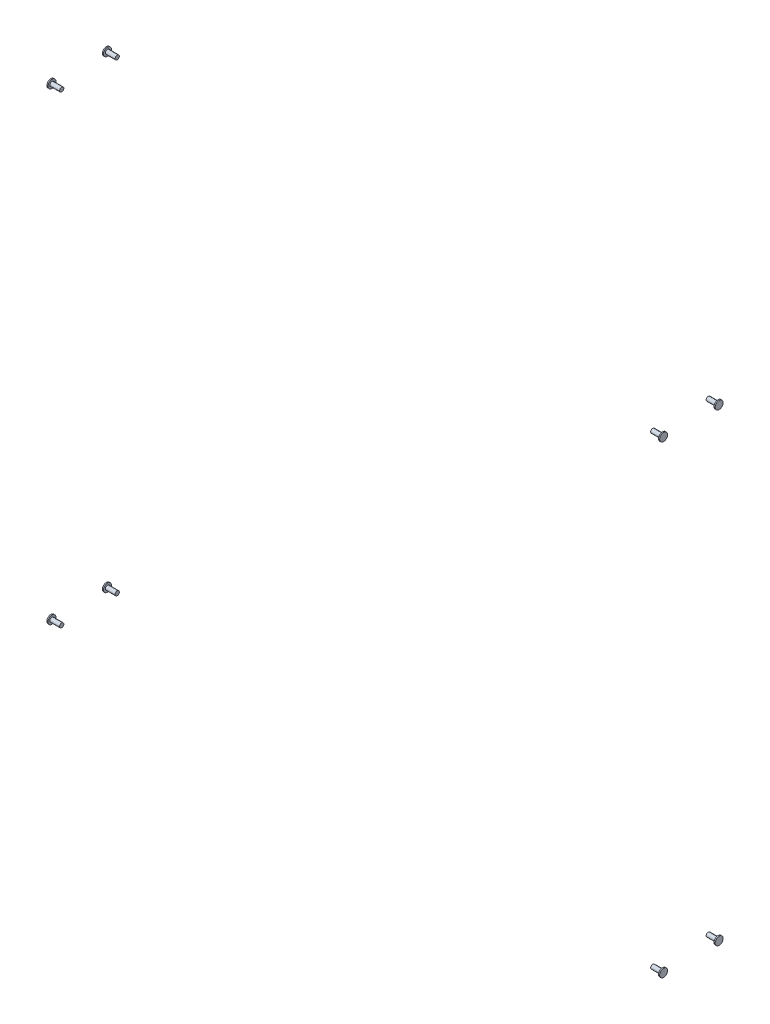
ISO-10303-21;
HEADER;
FILE_DESCRIPTION(('STEP AP214'),'2;1');
FILE_NAME('part.step','',(''),(''),'','','');
FILE_SCHEMA(('AUTOMOTIVE_DESIGN { 1 0 10303 214 1 1 1 1 }'));
ENDSEC;
DATA;
#1=APPLICATION_CONTEXT('core data for automotive mechanical design processes');
#2=APPLICATION_PROTOCOL_DEFINITION('international standard','automotive_design',2000,#1);
#3=PRODUCT_CONTEXT('',#1,'mechanical');
#4=PRODUCT('Part','Part','',(#3));
#5=PRODUCT_RELATED_PRODUCT_CATEGORY('part','',(#4));
#6=PRODUCT_DEFINITION_FORMATION('','',#4);
#7=PRODUCT_DEFINITION_CONTEXT('part definition',#1,'design');
#8=PRODUCT_DEFINITION('design','',#6,#7);
#9=PRODUCT_DEFINITION_SHAPE('','',#8);
#10=(LENGTH_UNIT() NAMED_UNIT(*) SI_UNIT(.MILLI.,.METRE.));
#11=(NAMED_UNIT(*) PLANE_ANGLE_UNIT() SI_UNIT($,.RADIAN.));
#12=(NAMED_UNIT(*) SI_UNIT($,.STERADIAN.) SOLID_ANGLE_UNIT());
#13=UNCERTAINTY_MEASURE_WITH_UNIT(LENGTH_MEASURE(1.E-05),#10,'distance_accuracy_value','');
#14=(GEOMETRIC_REPRESENTATION_CONTEXT(3) GLOBAL_UNCERTAINTY_ASSIGNED_CONTEXT((#13)) GLOBAL_UNIT_ASSIGNED_CONTEXT((#10,
#11,#12)) REPRESENTATION_CONTEXT('',''));
#15=CARTESIAN_POINT('',(0.,0.,0.));
#16=DIRECTION('',(0.,0.,1.));
#17=DIRECTION('',(1.,0.,0.));
#18=AXIS2_PLACEMENT_3D('',#15,#16,#17);
#19=CARTESIAN_POINT('',(-266.2,-209.,30.));
#20=DIRECTION('',(1.,0.,0.));
#21=DIRECTION('',(0.,0.,-1.));
#22=AXIS2_PLACEMENT_3D('',#19,#20,#21);
#23=PLANE('',#22);
#24=CARTESIAN_POINT('',(-266.2,-209.,30.));
#25=DIRECTION('',(-1.,0.,0.));
#26=DIRECTION('',(0.,0.,1.));
#27=AXIS2_PLACEMENT_3D('',#24,#25,#26);
#28=CIRCLE('',#27,1.9);
#29=CARTESIAN_POINT('',(-266.2,-209.,31.9));
#30=VERTEX_POINT('',#29);
#31=EDGE_CURVE('P0_E23',#30,#30,#28,.T.);
#32=ORIENTED_EDGE('',*,*,#31,.F.);
#33=EDGE_LOOP('',(#32));
#34=FACE_BOUND('',#33,.T.);
#35=ADVANCED_FACE('P0_F15',(#34),#23,.T.);
#36=CARTESIAN_POINT('',(-266.2,-209.,30.));
#37=DIRECTION('',(-1.,0.,0.));
#38=DIRECTION('',(0.,0.,1.));
#39=AXIS2_PLACEMENT_3D('',#36,#37,#38);
#40=CYLINDRICAL_SURFACE('',#39,1.9);
#41=CARTESIAN_POINT('',(-275.,-209.,30.));
#42=DIRECTION('',(1.,0.,0.));
#43=DIRECTION('',(0.,0.,-1.));
#44=AXIS2_PLACEMENT_3D('',#41,#42,#43);
#45=CIRCLE('',#44,1.9);
#46=CARTESIAN_POINT('',(-275.,-209.,28.1));
#47=VERTEX_POINT('',#46);
#48=EDGE_CURVE('P0_E10',#47,#47,#45,.F.);
#49=ORIENTED_EDGE('',*,*,#48,.F.);
#50=EDGE_LOOP('',(#49));
#51=FACE_BOUND('',#50,.T.);
#52=ORIENTED_EDGE('',*,*,#31,.T.);
#53=EDGE_LOOP('',(#52));
#54=FACE_BOUND('',#53,.T.);
#55=ADVANCED_FACE('P0_F17',(#51,#54),#40,.T.);
#56=CARTESIAN_POINT('',(-275.,-209.,30.));
#57=DIRECTION('',(1.,0.,0.));
#58=DIRECTION('',(0.,0.,-1.));
#59=AXIS2_PLACEMENT_3D('',#56,#57,#58);
#60=PLANE('',#59);
#61=ORIENTED_EDGE('',*,*,#48,.T.);
#62=EDGE_LOOP('',(#61));
#63=FACE_BOUND('',#62,.T.);
#64=CARTESIAN_POINT('',(-275.,-209.,30.));
#65=DIRECTION('',(-1.,0.,0.));
#66=DIRECTION('',(0.,0.,1.));
#67=AXIS2_PLACEMENT_3D('',#64,#65,#66);
#68=CIRCLE('',#67,3.6);
#69=CARTESIAN_POINT('',(-275.,-209.,33.6));
#70=VERTEX_POINT('',#69);
#71=EDGE_CURVE('P0_E35',#70,#70,#68,.T.);
#72=ORIENTED_EDGE('',*,*,#71,.F.);
#73=EDGE_LOOP('',(#72));
#74=FACE_BOUND('',#73,.T.);
#75=ADVANCED_FACE('P0_F43',(#63,#74),#60,.T.);
#76=CARTESIAN_POINT('',(-275.,-209.,30.));
#77=DIRECTION('',(-1.,0.,0.));
#78=DIRECTION('',(0.,0.,1.));
#79=AXIS2_PLACEMENT_3D('',#76,#77,#78);
#80=CYLINDRICAL_SURFACE('',#79,3.6);
#81=CARTESIAN_POINT('',(-276.,-209.,30.));
#82=DIRECTION('',(1.,0.,0.));
#83=DIRECTION('',(0.,0.,-1.));
#84=AXIS2_PLACEMENT_3D('',#81,#82,#83);
#85=CIRCLE('',#84,3.6);
#86=CARTESIAN_POINT('',(-276.,-209.,26.4));
#87=VERTEX_POINT('',#86);
#88=EDGE_CURVE('P0_E30',#87,#87,#85,.T.);
#89=ORIENTED_EDGE('',*,*,#88,.T.);
#90=EDGE_LOOP('',(#89));
#91=FACE_BOUND('',#90,.T.);
#92=ORIENTED_EDGE('',*,*,#71,.T.);
#93=EDGE_LOOP('',(#92));
#94=FACE_BOUND('',#93,.T.);
#95=ADVANCED_FACE('P0_F41',(#91,#94),#80,.T.);
#96=CARTESIAN_POINT('',(-276.,-209.,30.));
#97=DIRECTION('',(-1.,0.,0.));
#98=DIRECTION('',(0.,0.,1.));
#99=AXIS2_PLACEMENT_3D('',#96,#97,#98);
#100=PLANE('',#99);
#101=ORIENTED_EDGE('',*,*,#88,.F.);
#102=EDGE_LOOP('',(#101));
#103=FACE_BOUND('',#102,.T.);
#104=ADVANCED_FACE('P0_F50',(#103),#100,.T.);
#105=CLOSED_SHELL('',(#35,#55,#75,#95,#104));
#106=MANIFOLD_SOLID_BREP('P0_B1',#105);
#107=CARTESIAN_POINT('',(-266.2,-209.,80.));
#108=DIRECTION('',(1.,0.,0.));
#109=DIRECTION('',(0.,0.,-1.));
#110=AXIS2_PLACEMENT_3D('',#107,#108,#109);
#111=PLANE('',#110);
#112=CARTESIAN_POINT('',(-266.2,-209.,80.));
#113=DIRECTION('',(-1.,0.,0.));
#114=DIRECTION('',(0.,0.,1.));
#115=AXIS2_PLACEMENT_3D('',#112,#113,#114);
#116=CIRCLE('',#115,1.9);
#117=CARTESIAN_POINT('',(-266.2,-209.,81.9));
#118=VERTEX_POINT('',#117);
#119=EDGE_CURVE('P1_E23',#118,#118,#116,.T.);
#120=ORIENTED_EDGE('',*,*,#119,.F.);
#121=EDGE_LOOP('',(#120));
#122=FACE_BOUND('',#121,.T.);
#123=ADVANCED_FACE('P1_F15',(#122),#111,.T.);
#124=CARTESIAN_POINT('',(-266.2,-209.,80.));
#125=DIRECTION('',(-1.,0.,0.));
#126=DIRECTION('',(0.,0.,1.));
#127=AXIS2_PLACEMENT_3D('',#124,#125,#126);
#128=CYLINDRICAL_SURFACE('',#127,1.9);
#129=CARTESIAN_POINT('',(-275.,-209.,80.));
#130=DIRECTION('',(1.,0.,0.));
#131=DIRECTION('',(0.,0.,-1.));
#132=AXIS2_PLACEMENT_3D('',#129,#130,#131);
#133=CIRCLE('',#132,1.9);
#134=CARTESIAN_POINT('',(-275.,-209.,78.1));
#135=VERTEX_POINT('',#134);
#136=EDGE_CURVE('P1_E10',#135,#135,#133,.F.);
#137=ORIENTED_EDGE('',*,*,#136,.F.);
#138=EDGE_LOOP('',(#137));
#139=FACE_BOUND('',#138,.T.);
#140=ORIENTED_EDGE('',*,*,#119,.T.);
#141=EDGE_LOOP('',(#140));
#142=FACE_BOUND('',#141,.T.);
#143=ADVANCED_FACE('P1_F17',(#139,#142),#128,.T.);
#144=CARTESIAN_POINT('',(-275.,-209.,80.));
#145=DIRECTION('',(1.,0.,0.));
#146=DIRECTION('',(0.,0.,-1.));
#147=AXIS2_PLACEMENT_3D('',#144,#145,#146);
#148=PLANE('',#147);
#149=ORIENTED_EDGE('',*,*,#136,.T.);
#150=EDGE_LOOP('',(#149));
#151=FACE_BOUND('',#150,.T.);
#152=CARTESIAN_POINT('',(-275.,-209.,80.));
#153=DIRECTION('',(-1.,0.,0.));
#154=DIRECTION('',(0.,0.,1.));
#155=AXIS2_PLACEMENT_3D('',#152,#153,#154);
#156=CIRCLE('',#155,3.6);
#157=CARTESIAN_POINT('',(-275.,-209.,83.6));
#158=VERTEX_POINT('',#157);
#159=EDGE_CURVE('P1_E35',#158,#158,#156,.T.);
#160=ORIENTED_EDGE('',*,*,#159,.F.);
#161=EDGE_LOOP('',(#160));
#162=FACE_BOUND('',#161,.T.);
#163=ADVANCED_FACE('P1_F43',(#151,#162),#148,.T.);
#164=CARTESIAN_POINT('',(-275.,-209.,80.));
#165=DIRECTION('',(-1.,0.,0.));
#166=DIRECTION('',(0.,0.,1.));
#167=AXIS2_PLACEMENT_3D('',#164,#165,#166);
#168=CYLINDRICAL_SURFACE('',#167,3.6);
#169=CARTESIAN_POINT('',(-276.,-209.,80.));
#170=DIRECTION('',(1.,0.,0.));
#171=DIRECTION('',(0.,0.,-1.));
#172=AXIS2_PLACEMENT_3D('',#169,#170,#171);
#173=CIRCLE('',#172,3.6);
#174=CARTESIAN_POINT('',(-276.,-209.,76.4));
#175=VERTEX_POINT('',#174);
#176=EDGE_CURVE('P1_E30',#175,#175,#173,.T.);
#177=ORIENTED_EDGE('',*,*,#176,.T.);
#178=EDGE_LOOP('',(#177));
#179=FACE_BOUND('',#178,.T.);
#180=ORIENTED_EDGE('',*,*,#159,.T.);
#181=EDGE_LOOP('',(#180));
#182=FACE_BOUND('',#181,.T.);
#183=ADVANCED_FACE('P1_F41',(#179,#182),#168,.T.);
#184=CARTESIAN_POINT('',(-276.,-209.,80.));
#185=DIRECTION('',(-1.,0.,0.));
#186=DIRECTION('',(0.,0.,1.));
#187=AXIS2_PLACEMENT_3D('',#184,#185,#186);
#188=PLANE('',#187);
#189=ORIENTED_EDGE('',*,*,#176,.F.);
#190=EDGE_LOOP('',(#189));
#191=FACE_BOUND('',#190,.T.);
#192=ADVANCED_FACE('P1_F50',(#191),#188,.T.);
#193=CLOSED_SHELL('',(#123,#143,#163,#183,#192));
#194=MANIFOLD_SOLID_BREP('P1_B1',#193);
#195=CARTESIAN_POINT('',(-266.2,209.,30.));
#196=DIRECTION('',(1.,0.,0.));
#197=DIRECTION('',(0.,0.,-1.));
#198=AXIS2_PLACEMENT_3D('',#195,#196,#197);
#199=PLANE('',#198);
#200=CARTESIAN_POINT('',(-266.2,209.,30.));
#201=DIRECTION('',(-1.,0.,0.));
#202=DIRECTION('',(0.,0.,1.));
#203=AXIS2_PLACEMENT_3D('',#200,#201,#202);
#204=CIRCLE('',#203,1.9);
#205=CARTESIAN_POINT('',(-266.2,209.,31.9));
#206=VERTEX_POINT('',#205);
#207=EDGE_CURVE('P2_E23',#206,#206,#204,.T.);
#208=ORIENTED_EDGE('',*,*,#207,.F.);
#209=EDGE_LOOP('',(#208));
#210=FACE_BOUND('',#209,.T.);
#211=ADVANCED_FACE('P2_F15',(#210),#199,.T.);
#212=CARTESIAN_POINT('',(-266.2,209.,30.));
#213=DIRECTION('',(-1.,0.,0.));
#214=DIRECTION('',(0.,0.,1.));
#215=AXIS2_PLACEMENT_3D('',#212,#213,#214);
#216=CYLINDRICAL_SURFACE('',#215,1.9);
#217=CARTESIAN_POINT('',(-275.,209.,30.));
#218=DIRECTION('',(1.,0.,0.));
#219=DIRECTION('',(0.,0.,-1.));
#220=AXIS2_PLACEMENT_3D('',#217,#218,#219);
#221=CIRCLE('',#220,1.9);
#222=CARTESIAN_POINT('',(-275.,209.,28.1));
#223=VERTEX_POINT('',#222);
#224=EDGE_CURVE('P2_E10',#223,#223,#221,.F.);
#225=ORIENTED_EDGE('',*,*,#224,.F.);
#226=EDGE_LOOP('',(#225));
#227=FACE_BOUND('',#226,.T.);
#228=ORIENTED_EDGE('',*,*,#207,.T.);
#229=EDGE_LOOP('',(#228));
#230=FACE_BOUND('',#229,.T.);
#231=ADVANCED_FACE('P2_F17',(#227,#230),#216,.T.);
#232=CARTESIAN_POINT('',(-275.,209.,30.));
#233=DIRECTION('',(1.,0.,0.));
#234=DIRECTION('',(0.,0.,-1.));
#235=AXIS2_PLACEMENT_3D('',#232,#233,#234);
#236=PLANE('',#235);
#237=ORIENTED_EDGE('',*,*,#224,.T.);
#238=EDGE_LOOP('',(#237));
#239=FACE_BOUND('',#238,.T.);
#240=CARTESIAN_POINT('',(-275.,209.,30.));
#241=DIRECTION('',(-1.,0.,0.));
#242=DIRECTION('',(0.,0.,1.));
#243=AXIS2_PLACEMENT_3D('',#240,#241,#242);
#244=CIRCLE('',#243,3.6);
#245=CARTESIAN_POINT('',(-275.,209.,33.6));
#246=VERTEX_POINT('',#245);
#247=EDGE_CURVE('P2_E35',#246,#246,#244,.T.);
#248=ORIENTED_EDGE('',*,*,#247,.F.);
#249=EDGE_LOOP('',(#248));
#250=FACE_BOUND('',#249,.T.);
#251=ADVANCED_FACE('P2_F43',(#239,#250),#236,.T.);
#252=CARTESIAN_POINT('',(-275.,209.,30.));
#253=DIRECTION('',(-1.,0.,0.));
#254=DIRECTION('',(0.,0.,1.));
#255=AXIS2_PLACEMENT_3D('',#252,#253,#254);
#256=CYLINDRICAL_SURFACE('',#255,3.6);
#257=CARTESIAN_POINT('',(-276.,209.,30.));
#258=DIRECTION('',(1.,0.,0.));
#259=DIRECTION('',(0.,0.,-1.));
#260=AXIS2_PLACEMENT_3D('',#257,#258,#259);
#261=CIRCLE('',#260,3.6);
#262=CARTESIAN_POINT('',(-276.,209.,26.4));
#263=VERTEX_POINT('',#262);
#264=EDGE_CURVE('P2_E30',#263,#263,#261,.T.);
#265=ORIENTED_EDGE('',*,*,#264,.T.);
#266=EDGE_LOOP('',(#265));
#267=FACE_BOUND('',#266,.T.);
#268=ORIENTED_EDGE('',*,*,#247,.T.);
#269=EDGE_LOOP('',(#268));
#270=FACE_BOUND('',#269,.T.);
#271=ADVANCED_FACE('P2_F41',(#267,#270),#256,.T.);
#272=CARTESIAN_POINT('',(-276.,209.,30.));
#273=DIRECTION('',(-1.,0.,0.));
#274=DIRECTION('',(0.,0.,1.));
#275=AXIS2_PLACEMENT_3D('',#272,#273,#274);
#276=PLANE('',#275);
#277=ORIENTED_EDGE('',*,*,#264,.F.);
#278=EDGE_LOOP('',(#277));
#279=FACE_BOUND('',#278,.T.);
#280=ADVANCED_FACE('P2_F50',(#279),#276,.T.);
#281=CLOSED_SHELL('',(#211,#231,#251,#271,#280));
#282=MANIFOLD_SOLID_BREP('P2_B1',#281);
#283=CARTESIAN_POINT('',(-266.2,209.,80.));
#284=DIRECTION('',(1.,0.,0.));
#285=DIRECTION('',(0.,0.,-1.));
#286=AXIS2_PLACEMENT_3D('',#283,#284,#285);
#287=PLANE('',#286);
#288=CARTESIAN_POINT('',(-266.2,209.,80.));
#289=DIRECTION('',(-1.,0.,0.));
#290=DIRECTION('',(0.,0.,1.));
#291=AXIS2_PLACEMENT_3D('',#288,#289,#290);
#292=CIRCLE('',#291,1.9);
#293=CARTESIAN_POINT('',(-266.2,209.,81.9));
#294=VERTEX_POINT('',#293);
#295=EDGE_CURVE('P3_E23',#294,#294,#292,.T.);
#296=ORIENTED_EDGE('',*,*,#295,.F.);
#297=EDGE_LOOP('',(#296));
#298=FACE_BOUND('',#297,.T.);
#299=ADVANCED_FACE('P3_F15',(#298),#287,.T.);
#300=CARTESIAN_POINT('',(-266.2,209.,80.));
#301=DIRECTION('',(-1.,0.,0.));
#302=DIRECTION('',(0.,0.,1.));
#303=AXIS2_PLACEMENT_3D('',#300,#301,#302);
#304=CYLINDRICAL_SURFACE('',#303,1.9);
#305=CARTESIAN_POINT('',(-275.,209.,80.));
#306=DIRECTION('',(1.,0.,0.));
#307=DIRECTION('',(0.,0.,-1.));
#308=AXIS2_PLACEMENT_3D('',#305,#306,#307);
#309=CIRCLE('',#308,1.9);
#310=CARTESIAN_POINT('',(-275.,209.,78.1));
#311=VERTEX_POINT('',#310);
#312=EDGE_CURVE('P3_E10',#311,#311,#309,.F.);
#313=ORIENTED_EDGE('',*,*,#312,.F.);
#314=EDGE_LOOP('',(#313));
#315=FACE_BOUND('',#314,.T.);
#316=ORIENTED_EDGE('',*,*,#295,.T.);
#317=EDGE_LOOP('',(#316));
#318=FACE_BOUND('',#317,.T.);
#319=ADVANCED_FACE('P3_F17',(#315,#318),#304,.T.);
#320=CARTESIAN_POINT('',(-275.,209.,80.));
#321=DIRECTION('',(1.,0.,0.));
#322=DIRECTION('',(0.,0.,-1.));
#323=AXIS2_PLACEMENT_3D('',#320,#321,#322);
#324=PLANE('',#323);
#325=ORIENTED_EDGE('',*,*,#312,.T.);
#326=EDGE_LOOP('',(#325));
#327=FACE_BOUND('',#326,.T.);
#328=CARTESIAN_POINT('',(-275.,209.,80.));
#329=DIRECTION('',(-1.,0.,0.));
#330=DIRECTION('',(0.,0.,1.));
#331=AXIS2_PLACEMENT_3D('',#328,#329,#330);
#332=CIRCLE('',#331,3.6);
#333=CARTESIAN_POINT('',(-275.,209.,83.6));
#334=VERTEX_POINT('',#333);
#335=EDGE_CURVE('P3_E35',#334,#334,#332,.T.);
#336=ORIENTED_EDGE('',*,*,#335,.F.);
#337=EDGE_LOOP('',(#336));
#338=FACE_BOUND('',#337,.T.);
#339=ADVANCED_FACE('P3_F43',(#327,#338),#324,.T.);
#340=CARTESIAN_POINT('',(-275.,209.,80.));
#341=DIRECTION('',(-1.,0.,0.));
#342=DIRECTION('',(0.,0.,1.));
#343=AXIS2_PLACEMENT_3D('',#340,#341,#342);
#344=CYLINDRICAL_SURFACE('',#343,3.6);
#345=CARTESIAN_POINT('',(-276.,209.,80.));
#346=DIRECTION('',(1.,0.,0.));
#347=DIRECTION('',(0.,0.,-1.));
#348=AXIS2_PLACEMENT_3D('',#345,#346,#347);
#349=CIRCLE('',#348,3.6);
#350=CARTESIAN_POINT('',(-276.,209.,76.4));
#351=VERTEX_POINT('',#350);
#352=EDGE_CURVE('P3_E30',#351,#351,#349,.T.);
#353=ORIENTED_EDGE('',*,*,#352,.T.);
#354=EDGE_LOOP('',(#353));
#355=FACE_BOUND('',#354,.T.);
#356=ORIENTED_EDGE('',*,*,#335,.T.);
#357=EDGE_LOOP('',(#356));
#358=FACE_BOUND('',#357,.T.);
#359=ADVANCED_FACE('P3_F41',(#355,#358),#344,.T.);
#360=CARTESIAN_POINT('',(-276.,209.,80.));
#361=DIRECTION('',(-1.,0.,0.));
#362=DIRECTION('',(0.,0.,1.));
#363=AXIS2_PLACEMENT_3D('',#360,#361,#362);
#364=PLANE('',#363);
#365=ORIENTED_EDGE('',*,*,#352,.F.);
#366=EDGE_LOOP('',(#365));
#367=FACE_BOUND('',#366,.T.);
#368=ADVANCED_FACE('P3_F50',(#367),#364,.T.);
#369=CLOSED_SHELL('',(#299,#319,#339,#359,#368));
#370=MANIFOLD_SOLID_BREP('P3_B1',#369);
#371=CARTESIAN_POINT('',(266.2,-209.,30.));
#372=DIRECTION('',(-1.,0.,0.));
#373=DIRECTION('',(0.,0.,1.));
#374=AXIS2_PLACEMENT_3D('',#371,#372,#373);
#375=PLANE('',#374);
#376=CARTESIAN_POINT('',(266.2,-209.,30.));
#377=DIRECTION('',(1.,0.,0.));
#378=DIRECTION('',(0.,0.,-1.));
#379=AXIS2_PLACEMENT_3D('',#376,#377,#378);
#380=CIRCLE('',#379,1.9);
#381=CARTESIAN_POINT('',(266.2,-209.,28.1));
#382=VERTEX_POINT('',#381);
#383=EDGE_CURVE('P4_E23',#382,#382,#380,.T.);
#384=ORIENTED_EDGE('',*,*,#383,.F.);
#385=EDGE_LOOP('',(#384));
#386=FACE_BOUND('',#385,.T.);
#387=ADVANCED_FACE('P4_F15',(#386),#375,.T.);
#388=CARTESIAN_POINT('',(266.2,-209.,30.));
#389=DIRECTION('',(1.,0.,0.));
#390=DIRECTION('',(0.,0.,-1.));
#391=AXIS2_PLACEMENT_3D('',#388,#389,#390);
#392=CYLINDRICAL_SURFACE('',#391,1.9);
#393=CARTESIAN_POINT('',(275.,-209.,30.));
#394=DIRECTION('',(-1.,0.,0.));
#395=DIRECTION('',(0.,0.,1.));
#396=AXIS2_PLACEMENT_3D('',#393,#394,#395);
#397=CIRCLE('',#396,1.9);
#398=CARTESIAN_POINT('',(275.,-209.,31.9));
#399=VERTEX_POINT('',#398);
#400=EDGE_CURVE('P4_E10',#399,#399,#397,.F.);
#401=ORIENTED_EDGE('',*,*,#400,.F.);
#402=EDGE_LOOP('',(#401));
#403=FACE_BOUND('',#402,.T.);
#404=ORIENTED_EDGE('',*,*,#383,.T.);
#405=EDGE_LOOP('',(#404));
#406=FACE_BOUND('',#405,.T.);
#407=ADVANCED_FACE('P4_F17',(#403,#406),#392,.T.);
#408=CARTESIAN_POINT('',(275.,-209.,30.));
#409=DIRECTION('',(-1.,0.,0.));
#410=DIRECTION('',(0.,0.,1.));
#411=AXIS2_PLACEMENT_3D('',#408,#409,#410);
#412=PLANE('',#411);
#413=ORIENTED_EDGE('',*,*,#400,.T.);
#414=EDGE_LOOP('',(#413));
#415=FACE_BOUND('',#414,.T.);
#416=CARTESIAN_POINT('',(275.,-209.,30.));
#417=DIRECTION('',(1.,0.,0.));
#418=DIRECTION('',(0.,0.,-1.));
#419=AXIS2_PLACEMENT_3D('',#416,#417,#418);
#420=CIRCLE('',#419,3.6);
#421=CARTESIAN_POINT('',(275.,-209.,26.4));
#422=VERTEX_POINT('',#421);
#423=EDGE_CURVE('P4_E35',#422,#422,#420,.T.);
#424=ORIENTED_EDGE('',*,*,#423,.F.);
#425=EDGE_LOOP('',(#424));
#426=FACE_BOUND('',#425,.T.);
#427=ADVANCED_FACE('P4_F43',(#415,#426),#412,.T.);
#428=CARTESIAN_POINT('',(275.,-209.,30.));
#429=DIRECTION('',(1.,0.,0.));
#430=DIRECTION('',(0.,0.,-1.));
#431=AXIS2_PLACEMENT_3D('',#428,#429,#430);
#432=CYLINDRICAL_SURFACE('',#431,3.6);
#433=CARTESIAN_POINT('',(276.,-209.,30.));
#434=DIRECTION('',(-1.,0.,0.));
#435=DIRECTION('',(0.,0.,1.));
#436=AXIS2_PLACEMENT_3D('',#433,#434,#435);
#437=CIRCLE('',#436,3.6);
#438=CARTESIAN_POINT('',(276.,-209.,33.6));
#439=VERTEX_POINT('',#438);
#440=EDGE_CURVE('P4_E30',#439,#439,#437,.T.);
#441=ORIENTED_EDGE('',*,*,#440,.T.);
#442=EDGE_LOOP('',(#441));
#443=FACE_BOUND('',#442,.T.);
#444=ORIENTED_EDGE('',*,*,#423,.T.);
#445=EDGE_LOOP('',(#444));
#446=FACE_BOUND('',#445,.T.);
#447=ADVANCED_FACE('P4_F41',(#443,#446),#432,.T.);
#448=CARTESIAN_POINT('',(276.,-209.,30.));
#449=DIRECTION('',(1.,0.,0.));
#450=DIRECTION('',(0.,0.,-1.));
#451=AXIS2_PLACEMENT_3D('',#448,#449,#450);
#452=PLANE('',#451);
#453=ORIENTED_EDGE('',*,*,#440,.F.);
#454=EDGE_LOOP('',(#453));
#455=FACE_BOUND('',#454,.T.);
#456=ADVANCED_FACE('P4_F50',(#455),#452,.T.);
#457=CLOSED_SHELL('',(#387,#407,#427,#447,#456));
#458=MANIFOLD_SOLID_BREP('P4_B1',#457);
#459=CARTESIAN_POINT('',(266.2,-209.,80.));
#460=DIRECTION('',(-1.,0.,0.));
#461=DIRECTION('',(0.,0.,1.));
#462=AXIS2_PLACEMENT_3D('',#459,#460,#461);
#463=PLANE('',#462);
#464=CARTESIAN_POINT('',(266.2,-209.,80.));
#465=DIRECTION('',(1.,0.,0.));
#466=DIRECTION('',(0.,0.,-1.));
#467=AXIS2_PLACEMENT_3D('',#464,#465,#466);
#468=CIRCLE('',#467,1.9);
#469=CARTESIAN_POINT('',(266.2,-209.,78.1));
#470=VERTEX_POINT('',#469);
#471=EDGE_CURVE('P5_E23',#470,#470,#468,.T.);
#472=ORIENTED_EDGE('',*,*,#471,.F.);
#473=EDGE_LOOP('',(#472));
#474=FACE_BOUND('',#473,.T.);
#475=ADVANCED_FACE('P5_F15',(#474),#463,.T.);
#476=CARTESIAN_POINT('',(266.2,-209.,80.));
#477=DIRECTION('',(1.,0.,0.));
#478=DIRECTION('',(0.,0.,-1.));
#479=AXIS2_PLACEMENT_3D('',#476,#477,#478);
#480=CYLINDRICAL_SURFACE('',#479,1.9);
#481=CARTESIAN_POINT('',(275.,-209.,80.));
#482=DIRECTION('',(-1.,0.,0.));
#483=DIRECTION('',(0.,0.,1.));
#484=AXIS2_PLACEMENT_3D('',#481,#482,#483);
#485=CIRCLE('',#484,1.9);
#486=CARTESIAN_POINT('',(275.,-209.,81.9));
#487=VERTEX_POINT('',#486);
#488=EDGE_CURVE('P5_E10',#487,#487,#485,.F.);
#489=ORIENTED_EDGE('',*,*,#488,.F.);
#490=EDGE_LOOP('',(#489));
#491=FACE_BOUND('',#490,.T.);
#492=ORIENTED_EDGE('',*,*,#471,.T.);
#493=EDGE_LOOP('',(#492));
#494=FACE_BOUND('',#493,.T.);
#495=ADVANCED_FACE('P5_F17',(#491,#494),#480,.T.);
#496=CARTESIAN_POINT('',(275.,-209.,80.));
#497=DIRECTION('',(-1.,0.,0.));
#498=DIRECTION('',(0.,0.,1.));
#499=AXIS2_PLACEMENT_3D('',#496,#497,#498);
#500=PLANE('',#499);
#501=ORIENTED_EDGE('',*,*,#488,.T.);
#502=EDGE_LOOP('',(#501));
#503=FACE_BOUND('',#502,.T.);
#504=CARTESIAN_POINT('',(275.,-209.,80.));
#505=DIRECTION('',(1.,0.,0.));
#506=DIRECTION('',(0.,0.,-1.));
#507=AXIS2_PLACEMENT_3D('',#504,#505,#506);
#508=CIRCLE('',#507,3.6);
#509=CARTESIAN_POINT('',(275.,-209.,76.4));
#510=VERTEX_POINT('',#509);
#511=EDGE_CURVE('P5_E35',#510,#510,#508,.T.);
#512=ORIENTED_EDGE('',*,*,#511,.F.);
#513=EDGE_LOOP('',(#512));
#514=FACE_BOUND('',#513,.T.);
#515=ADVANCED_FACE('P5_F43',(#503,#514),#500,.T.);
#516=CARTESIAN_POINT('',(275.,-209.,80.));
#517=DIRECTION('',(1.,0.,0.));
#518=DIRECTION('',(0.,0.,-1.));
#519=AXIS2_PLACEMENT_3D('',#516,#517,#518);
#520=CYLINDRICAL_SURFACE('',#519,3.6);
#521=CARTESIAN_POINT('',(276.,-209.,80.));
#522=DIRECTION('',(-1.,0.,0.));
#523=DIRECTION('',(0.,0.,1.));
#524=AXIS2_PLACEMENT_3D('',#521,#522,#523);
#525=CIRCLE('',#524,3.6);
#526=CARTESIAN_POINT('',(276.,-209.,83.6));
#527=VERTEX_POINT('',#526);
#528=EDGE_CURVE('P5_E29',#527,#527,#525,.T.);
#529=ORIENTED_EDGE('',*,*,#528,.T.);
#530=EDGE_LOOP('',(#529));
#531=FACE_BOUND('',#530,.T.);
#532=ORIENTED_EDGE('',*,*,#511,.T.);
#533=EDGE_LOOP('',(#532));
#534=FACE_BOUND('',#533,.T.);
#535=ADVANCED_FACE('P5_F41',(#531,#534),#520,.T.);
#536=CARTESIAN_POINT('',(276.,-209.,80.));
#537=DIRECTION('',(1.,0.,0.));
#538=DIRECTION('',(0.,0.,-1.));
#539=AXIS2_PLACEMENT_3D('',#536,#537,#538);
#540=PLANE('',#539);
#541=ORIENTED_EDGE('',*,*,#528,.F.);
#542=EDGE_LOOP('',(#541));
#543=FACE_BOUND('',#542,.T.);
#544=ADVANCED_FACE('P5_F50',(#543),#540,.T.);
#545=CLOSED_SHELL('',(#475,#495,#515,#535,#544));
#546=MANIFOLD_SOLID_BREP('P5_B1',#545);
#547=CARTESIAN_POINT('',(266.2,209.,30.));
#548=DIRECTION('',(-1.,0.,0.));
#549=DIRECTION('',(0.,0.,1.));
#550=AXIS2_PLACEMENT_3D('',#547,#548,#549);
#551=PLANE('',#550);
#552=CARTESIAN_POINT('',(266.2,209.,30.));
#553=DIRECTION('',(1.,0.,0.));
#554=DIRECTION('',(0.,0.,-1.));
#555=AXIS2_PLACEMENT_3D('',#552,#553,#554);
#556=CIRCLE('',#555,1.9);
#557=CARTESIAN_POINT('',(266.2,209.,28.1));
#558=VERTEX_POINT('',#557);
#559=EDGE_CURVE('P6_E23',#558,#558,#556,.T.);
#560=ORIENTED_EDGE('',*,*,#559,.F.);
#561=EDGE_LOOP('',(#560));
#562=FACE_BOUND('',#561,.T.);
#563=ADVANCED_FACE('P6_F15',(#562),#551,.T.);
#564=CARTESIAN_POINT('',(266.2,209.,30.));
#565=DIRECTION('',(1.,0.,0.));
#566=DIRECTION('',(0.,0.,-1.));
#567=AXIS2_PLACEMENT_3D('',#564,#565,#566);
#568=CYLINDRICAL_SURFACE('',#567,1.9);
#569=CARTESIAN_POINT('',(275.,209.,30.));
#570=DIRECTION('',(-1.,0.,0.));
#571=DIRECTION('',(0.,0.,1.));
#572=AXIS2_PLACEMENT_3D('',#569,#570,#571);
#573=CIRCLE('',#572,1.9);
#574=CARTESIAN_POINT('',(275.,209.,31.9));
#575=VERTEX_POINT('',#574);
#576=EDGE_CURVE('P6_E10',#575,#575,#573,.F.);
#577=ORIENTED_EDGE('',*,*,#576,.F.);
#578=EDGE_LOOP('',(#577));
#579=FACE_BOUND('',#578,.T.);
#580=ORIENTED_EDGE('',*,*,#559,.T.);
#581=EDGE_LOOP('',(#580));
#582=FACE_BOUND('',#581,.T.);
#583=ADVANCED_FACE('P6_F17',(#579,#582),#568,.T.);
#584=CARTESIAN_POINT('',(275.,209.,30.));
#585=DIRECTION('',(-1.,0.,0.));
#586=DIRECTION('',(0.,0.,1.));
#587=AXIS2_PLACEMENT_3D('',#584,#585,#586);
#588=PLANE('',#587);
#589=ORIENTED_EDGE('',*,*,#576,.T.);
#590=EDGE_LOOP('',(#589));
#591=FACE_BOUND('',#590,.T.);
#592=CARTESIAN_POINT('',(275.,209.,30.));
#593=DIRECTION('',(1.,0.,0.));
#594=DIRECTION('',(0.,0.,-1.));
#595=AXIS2_PLACEMENT_3D('',#592,#593,#594);
#596=CIRCLE('',#595,3.6);
#597=CARTESIAN_POINT('',(275.,209.,26.4));
#598=VERTEX_POINT('',#597);
#599=EDGE_CURVE('P6_E35',#598,#598,#596,.T.);
#600=ORIENTED_EDGE('',*,*,#599,.F.);
#601=EDGE_LOOP('',(#600));
#602=FACE_BOUND('',#601,.T.);
#603=ADVANCED_FACE('P6_F43',(#591,#602),#588,.T.);
#604=CARTESIAN_POINT('',(275.,209.,30.));
#605=DIRECTION('',(1.,0.,0.));
#606=DIRECTION('',(0.,0.,-1.));
#607=AXIS2_PLACEMENT_3D('',#604,#605,#606);
#608=CYLINDRICAL_SURFACE('',#607,3.6);
#609=CARTESIAN_POINT('',(276.,209.,30.));
#610=DIRECTION('',(-1.,0.,0.));
#611=DIRECTION('',(0.,0.,1.));
#612=AXIS2_PLACEMENT_3D('',#609,#610,#611);
#613=CIRCLE('',#612,3.6);
#614=CARTESIAN_POINT('',(276.,209.,33.6));
#615=VERTEX_POINT('',#614);
#616=EDGE_CURVE('P6_E31',#615,#615,#613,.T.);
#617=ORIENTED_EDGE('',*,*,#616,.T.);
#618=EDGE_LOOP('',(#617));
#619=FACE_BOUND('',#618,.T.);
#620=ORIENTED_EDGE('',*,*,#599,.T.);
#621=EDGE_LOOP('',(#620));
#622=FACE_BOUND('',#621,.T.);
#623=ADVANCED_FACE('P6_F41',(#619,#622),#608,.T.);
#624=CARTESIAN_POINT('',(276.,209.,30.));
#625=DIRECTION('',(1.,0.,0.));
#626=DIRECTION('',(0.,0.,-1.));
#627=AXIS2_PLACEMENT_3D('',#624,#625,#626);
#628=PLANE('',#627);
#629=ORIENTED_EDGE('',*,*,#616,.F.);
#630=EDGE_LOOP('',(#629));
#631=FACE_BOUND('',#630,.T.);
#632=ADVANCED_FACE('P6_F50',(#631),#628,.T.);
#633=CLOSED_SHELL('',(#563,#583,#603,#623,#632));
#634=MANIFOLD_SOLID_BREP('P6_B1',#633);
#635=CARTESIAN_POINT('',(266.2,209.,80.));
#636=DIRECTION('',(-1.,0.,0.));
#637=DIRECTION('',(0.,0.,1.));
#638=AXIS2_PLACEMENT_3D('',#635,#636,#637);
#639=PLANE('',#638);
#640=CARTESIAN_POINT('',(266.2,209.,80.));
#641=DIRECTION('',(1.,0.,0.));
#642=DIRECTION('',(0.,0.,-1.));
#643=AXIS2_PLACEMENT_3D('',#640,#641,#642);
#644=CIRCLE('',#643,1.9);
#645=CARTESIAN_POINT('',(266.2,209.,78.1));
#646=VERTEX_POINT('',#645);
#647=EDGE_CURVE('P7_E23',#646,#646,#644,.T.);
#648=ORIENTED_EDGE('',*,*,#647,.F.);
#649=EDGE_LOOP('',(#648));
#650=FACE_BOUND('',#649,.T.);
#651=ADVANCED_FACE('P7_F15',(#650),#639,.T.);
#652=CARTESIAN_POINT('',(266.2,209.,80.));
#653=DIRECTION('',(1.,0.,0.));
#654=DIRECTION('',(0.,0.,-1.));
#655=AXIS2_PLACEMENT_3D('',#652,#653,#654);
#656=CYLINDRICAL_SURFACE('',#655,1.9);
#657=CARTESIAN_POINT('',(275.,209.,80.));
#658=DIRECTION('',(-1.,0.,0.));
#659=DIRECTION('',(0.,0.,1.));
#660=AXIS2_PLACEMENT_3D('',#657,#658,#659);
#661=CIRCLE('',#660,1.9);
#662=CARTESIAN_POINT('',(275.,209.,81.9));
#663=VERTEX_POINT('',#662);
#664=EDGE_CURVE('P7_E10',#663,#663,#661,.F.);
#665=ORIENTED_EDGE('',*,*,#664,.F.);
#666=EDGE_LOOP('',(#665));
#667=FACE_BOUND('',#666,.T.);
#668=ORIENTED_EDGE('',*,*,#647,.T.);
#669=EDGE_LOOP('',(#668));
#670=FACE_BOUND('',#669,.T.);
#671=ADVANCED_FACE('P7_F17',(#667,#670),#656,.T.);
#672=CARTESIAN_POINT('',(275.,209.,80.));
#673=DIRECTION('',(-1.,0.,0.));
#674=DIRECTION('',(0.,0.,1.));
#675=AXIS2_PLACEMENT_3D('',#672,#673,#674);
#676=PLANE('',#675);
#677=ORIENTED_EDGE('',*,*,#664,.T.);
#678=EDGE_LOOP('',(#677));
#679=FACE_BOUND('',#678,.T.);
#680=CARTESIAN_POINT('',(275.,209.,80.));
#681=DIRECTION('',(1.,0.,0.));
#682=DIRECTION('',(0.,0.,-1.));
#683=AXIS2_PLACEMENT_3D('',#680,#681,#682);
#684=CIRCLE('',#683,3.6);
#685=CARTESIAN_POINT('',(275.,209.,76.4));
#686=VERTEX_POINT('',#685);
#687=EDGE_CURVE('P7_E35',#686,#686,#684,.T.);
#688=ORIENTED_EDGE('',*,*,#687,.F.);
#689=EDGE_LOOP('',(#688));
#690=FACE_BOUND('',#689,.T.);
#691=ADVANCED_FACE('P7_F43',(#679,#690),#676,.T.);
#692=CARTESIAN_POINT('',(275.,209.,80.));
#693=DIRECTION('',(1.,0.,0.));
#694=DIRECTION('',(0.,0.,-1.));
#695=AXIS2_PLACEMENT_3D('',#692,#693,#694);
#696=CYLINDRICAL_SURFACE('',#695,3.6);
#697=CARTESIAN_POINT('',(276.,209.,80.));
#698=DIRECTION('',(-1.,0.,0.));
#699=DIRECTION('',(0.,0.,1.));
#700=AXIS2_PLACEMENT_3D('',#697,#698,#699);
#701=CIRCLE('',#700,3.6);
#702=CARTESIAN_POINT('',(276.,209.,83.6));
#703=VERTEX_POINT('',#702);
#704=EDGE_CURVE('P7_E29',#703,#703,#701,.T.);
#705=ORIENTED_EDGE('',*,*,#704,.T.);
#706=EDGE_LOOP('',(#705));
#707=FACE_BOUND('',#706,.T.);
#708=ORIENTED_EDGE('',*,*,#687,.T.);
#709=EDGE_LOOP('',(#708));
#710=FACE_BOUND('',#709,.T.);
#711=ADVANCED_FACE('P7_F41',(#707,#710),#696,.T.);
#712=CARTESIAN_POINT('',(276.,209.,80.));
#713=DIRECTION('',(1.,0.,0.));
#714=DIRECTION('',(0.,0.,-1.));
#715=AXIS2_PLACEMENT_3D('',#712,#713,#714);
#716=PLANE('',#715);
#717=ORIENTED_EDGE('',*,*,#704,.F.);
#718=EDGE_LOOP('',(#717));
#719=FACE_BOUND('',#718,.T.);
#720=ADVANCED_FACE('P7_F50',(#719),#716,.T.);
#721=CLOSED_SHELL('',(#651,#671,#691,#711,#720));
#722=MANIFOLD_SOLID_BREP('P7_B1',#721);
#723=ADVANCED_BREP_SHAPE_REPRESENTATION('',(#18,#106,#194,#282,#370,#458,#546,#634,#722),#14);
#724=SHAPE_DEFINITION_REPRESENTATION(#9,#723);
ENDSEC;
END-ISO-10303-21;
